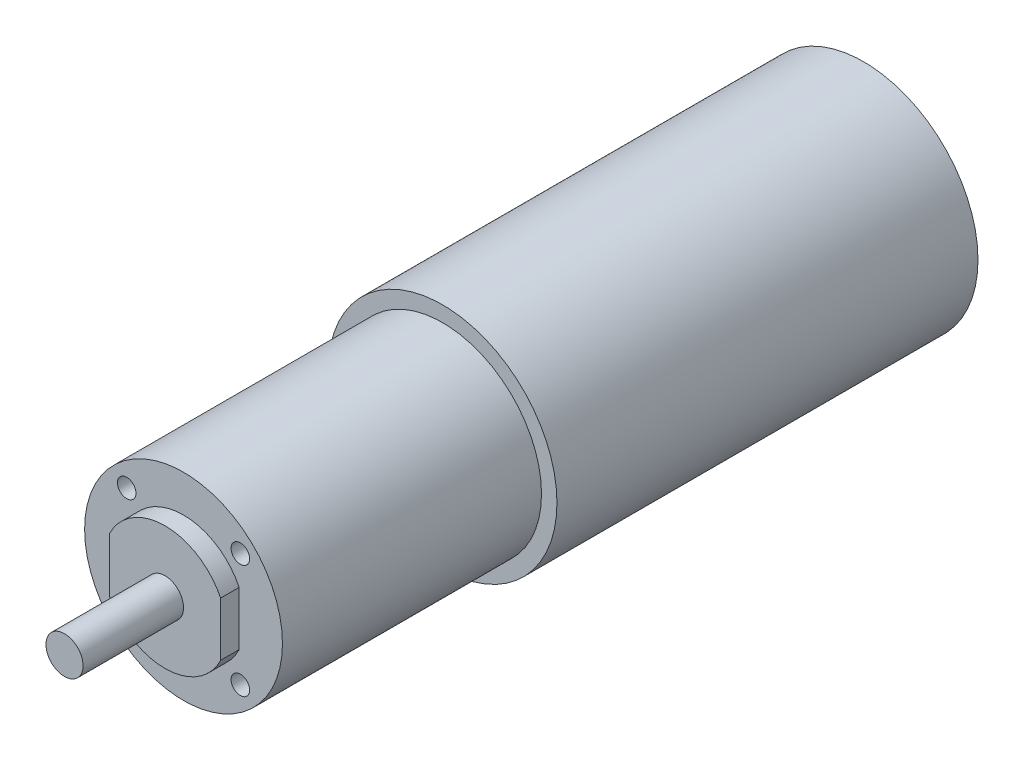
ISO-10303-21;
HEADER;
FILE_DESCRIPTION(('STEP AP214'),'2;1');
FILE_NAME('part.step','',(''),(''),'','','');
FILE_SCHEMA(('AUTOMOTIVE_DESIGN { 1 0 10303 214 1 1 1 1 }'));
ENDSEC;
DATA;
#1=APPLICATION_CONTEXT('core data for automotive mechanical design processes');
#2=APPLICATION_PROTOCOL_DEFINITION('international standard','automotive_design',2000,#1);
#3=PRODUCT_CONTEXT('',#1,'mechanical');
#4=PRODUCT('Part','Part','',(#3));
#5=PRODUCT_RELATED_PRODUCT_CATEGORY('part','',(#4));
#6=PRODUCT_DEFINITION_FORMATION('','',#4);
#7=PRODUCT_DEFINITION_CONTEXT('part definition',#1,'design');
#8=PRODUCT_DEFINITION('design','',#6,#7);
#9=PRODUCT_DEFINITION_SHAPE('','',#8);
#10=(LENGTH_UNIT() NAMED_UNIT(*) SI_UNIT(.MILLI.,.METRE.));
#11=(NAMED_UNIT(*) PLANE_ANGLE_UNIT() SI_UNIT($,.RADIAN.));
#12=(NAMED_UNIT(*) SI_UNIT($,.STERADIAN.) SOLID_ANGLE_UNIT());
#13=UNCERTAINTY_MEASURE_WITH_UNIT(LENGTH_MEASURE(1.E-05),#10,'distance_accuracy_value','');
#14=(GEOMETRIC_REPRESENTATION_CONTEXT(3) GLOBAL_UNCERTAINTY_ASSIGNED_CONTEXT((#13)) GLOBAL_UNIT_ASSIGNED_CONTEXT((#10,
#11,#12)) REPRESENTATION_CONTEXT('',''));
#15=CARTESIAN_POINT('',(0.,0.,0.));
#16=DIRECTION('',(0.,0.,1.));
#17=DIRECTION('',(1.,0.,0.));
#18=AXIS2_PLACEMENT_3D('',#15,#16,#17);
#19=CARTESIAN_POINT('',(0.,0.,41.9));
#20=DIRECTION('',(0.,0.,1.));
#21=DIRECTION('',(1.,0.,0.));
#22=AXIS2_PLACEMENT_3D('',#19,#20,#21);
#23=PLANE('',#22);
#24=CARTESIAN_POINT('',(-9.19238815542512,-9.19238815542512,41.9));
#25=DIRECTION('',(0.,0.,1.));
#26=DIRECTION('',(1.,0.,0.));
#27=AXIS2_PLACEMENT_3D('',#24,#25,#26);
#28=CIRCLE('',#27,1.5);
#29=CARTESIAN_POINT('',(-7.69238815542512,-9.19238815542512,41.9));
#30=VERTEX_POINT('',#29);
#31=EDGE_CURVE('E131',#30,#30,#28,.T.);
#32=ORIENTED_EDGE('',*,*,#31,.F.);
#33=EDGE_LOOP('',(#32));
#34=FACE_BOUND('',#33,.T.);
#35=CARTESIAN_POINT('',(9.19238815542512,-9.19238815542511,41.9));
#36=DIRECTION('',(0.,0.,1.));
#37=DIRECTION('',(1.,0.,0.));
#38=AXIS2_PLACEMENT_3D('',#35,#36,#37);
#39=CIRCLE('',#38,1.5);
#40=CARTESIAN_POINT('',(10.6923881554251,-9.19238815542511,41.9));
#41=VERTEX_POINT('',#40);
#42=EDGE_CURVE('E145',#41,#41,#39,.T.);
#43=ORIENTED_EDGE('',*,*,#42,.F.);
#44=EDGE_LOOP('',(#43));
#45=FACE_BOUND('',#44,.T.);
#46=CARTESIAN_POINT('',(9.19238815542511,9.19238815542512,41.9));
#47=DIRECTION('',(0.,0.,1.));
#48=DIRECTION('',(1.,0.,0.));
#49=AXIS2_PLACEMENT_3D('',#46,#47,#48);
#50=CIRCLE('',#49,1.5);
#51=CARTESIAN_POINT('',(10.6923881554251,9.19238815542512,41.9));
#52=VERTEX_POINT('',#51);
#53=EDGE_CURVE('E137',#52,#52,#50,.T.);
#54=ORIENTED_EDGE('',*,*,#53,.F.);
#55=EDGE_LOOP('',(#54));
#56=FACE_BOUND('',#55,.T.);
#57=CARTESIAN_POINT('',(-9.19238815542512,9.19238815542511,41.9));
#58=DIRECTION('',(0.,0.,1.));
#59=DIRECTION('',(1.,0.,0.));
#60=AXIS2_PLACEMENT_3D('',#57,#58,#59);
#61=CIRCLE('',#60,1.5);
#62=CARTESIAN_POINT('',(-7.69238815542512,9.19238815542511,41.9));
#63=VERTEX_POINT('',#62);
#64=EDGE_CURVE('E136',#63,#63,#61,.T.);
#65=ORIENTED_EDGE('',*,*,#64,.F.);
#66=EDGE_LOOP('',(#65));
#67=FACE_BOUND('',#66,.T.);
#68=CARTESIAN_POINT('',(0.,0.,41.9));
#69=DIRECTION('',(0.,0.,1.));
#70=DIRECTION('',(1.,0.,0.));
#71=AXIS2_PLACEMENT_3D('',#68,#69,#70);
#72=CIRCLE('',#71,16.);
#73=CARTESIAN_POINT('',(16.,0.,41.9));
#74=VERTEX_POINT('',#73);
#75=EDGE_CURVE('E49',#74,#74,#72,.T.);
#76=ORIENTED_EDGE('',*,*,#75,.T.);
#77=EDGE_LOOP('',(#76));
#78=FACE_BOUND('',#77,.T.);
#79=DIRECTION('',(0.,-1.,0.));
#80=VECTOR('',#79,1.);
#81=CARTESIAN_POINT('',(-9.,4.35889894354068,41.9));
#82=LINE('',#81,#80);
#83=CARTESIAN_POINT('',(-9.,4.35889894354068,41.9));
#84=VERTEX_POINT('',#83);
#85=CARTESIAN_POINT('',(-9.,-4.35889894354067,41.9));
#86=VERTEX_POINT('',#85);
#87=EDGE_CURVE('E99',#84,#86,#82,.T.);
#88=ORIENTED_EDGE('',*,*,#87,.F.);
#89=CARTESIAN_POINT('',(0.,0.,41.9));
#90=DIRECTION('',(0.,0.,1.));
#91=DIRECTION('',(1.,0.,0.));
#92=AXIS2_PLACEMENT_3D('',#89,#90,#91);
#93=CIRCLE('',#92,10.);
#94=CARTESIAN_POINT('',(9.,4.35889894354067,41.9));
#95=VERTEX_POINT('',#94);
#96=EDGE_CURVE('E113',#95,#84,#93,.T.);
#97=ORIENTED_EDGE('',*,*,#96,.F.);
#98=DIRECTION('',(0.,1.,0.));
#99=VECTOR('',#98,1.);
#100=CARTESIAN_POINT('',(9.,4.35889894354067,41.9));
#101=LINE('',#100,#99);
#102=CARTESIAN_POINT('',(9.,-4.35889894354067,41.9));
#103=VERTEX_POINT('',#102);
#104=EDGE_CURVE('E79',#103,#95,#101,.T.);
#105=ORIENTED_EDGE('',*,*,#104,.F.);
#106=CARTESIAN_POINT('',(0.,0.,41.9));
#107=DIRECTION('',(0.,0.,1.));
#108=DIRECTION('',(1.,0.,0.));
#109=AXIS2_PLACEMENT_3D('',#106,#107,#108);
#110=CIRCLE('',#109,10.);
#111=EDGE_CURVE('E120',#86,#103,#110,.T.);
#112=ORIENTED_EDGE('',*,*,#111,.F.);
#113=EDGE_LOOP('',(#88,#97,#105,#112));
#114=FACE_BOUND('',#113,.T.);
#115=ADVANCED_FACE('F39',(#34,#45,#56,#67,#78,#114),#23,.T.);
#116=CARTESIAN_POINT('',(0.,0.,41.9));
#117=DIRECTION('',(0.,0.,-1.));
#118=DIRECTION('',(-1.,0.,0.));
#119=AXIS2_PLACEMENT_3D('',#116,#117,#118);
#120=CYLINDRICAL_SURFACE('',#119,16.);
#121=ORIENTED_EDGE('',*,*,#75,.F.);
#122=EDGE_LOOP('',(#121));
#123=FACE_BOUND('',#122,.T.);
#124=CARTESIAN_POINT('',(0.,0.,0.));
#125=DIRECTION('',(0.,0.,1.));
#126=DIRECTION('',(1.,0.,0.));
#127=AXIS2_PLACEMENT_3D('',#124,#125,#126);
#128=CIRCLE('',#127,16.);
#129=CARTESIAN_POINT('',(16.,0.,0.));
#130=VERTEX_POINT('',#129);
#131=EDGE_CURVE('E43',#130,#130,#128,.T.);
#132=ORIENTED_EDGE('',*,*,#131,.T.);
#133=EDGE_LOOP('',(#132));
#134=FACE_BOUND('',#133,.T.);
#135=ADVANCED_FACE('F41',(#123,#134),#120,.T.);
#136=CARTESIAN_POINT('',(-9.19238815542512,9.19238815542511,36.9));
#137=DIRECTION('',(0.,0.,1.));
#138=DIRECTION('',(1.,0.,0.));
#139=AXIS2_PLACEMENT_3D('',#136,#137,#138);
#140=CYLINDRICAL_SURFACE('',#139,1.5);
#141=CARTESIAN_POINT('',(-9.19238815542512,9.19238815542511,36.9));
#142=DIRECTION('',(0.,0.,1.));
#143=DIRECTION('',(1.,0.,0.));
#144=AXIS2_PLACEMENT_3D('',#141,#142,#143);
#145=CIRCLE('',#144,1.5);
#146=CARTESIAN_POINT('',(-7.69238815542512,9.19238815542511,36.9));
#147=VERTEX_POINT('',#146);
#148=EDGE_CURVE('E156',#147,#147,#145,.T.);
#149=ORIENTED_EDGE('',*,*,#148,.F.);
#150=EDGE_LOOP('',(#149));
#151=FACE_BOUND('',#150,.T.);
#152=ORIENTED_EDGE('',*,*,#64,.T.);
#153=EDGE_LOOP('',(#152));
#154=FACE_BOUND('',#153,.T.);
#155=ADVANCED_FACE('F170',(#151,#154),#140,.F.);
#156=CARTESIAN_POINT('',(-9.19238815542512,9.19238815542511,36.9));
#157=DIRECTION('',(0.,0.,1.));
#158=DIRECTION('',(1.,0.,0.));
#159=AXIS2_PLACEMENT_3D('',#156,#157,#158);
#160=PLANE('',#159);
#161=ORIENTED_EDGE('',*,*,#148,.T.);
#162=EDGE_LOOP('',(#161));
#163=FACE_BOUND('',#162,.T.);
#164=ADVANCED_FACE('F211',(#163),#160,.T.);
#165=CARTESIAN_POINT('',(9.19238815542511,9.19238815542512,36.9));
#166=DIRECTION('',(0.,0.,1.));
#167=DIRECTION('',(1.,0.,0.));
#168=AXIS2_PLACEMENT_3D('',#165,#166,#167);
#169=CYLINDRICAL_SURFACE('',#168,1.5);
#170=CARTESIAN_POINT('',(9.19238815542511,9.19238815542512,36.9));
#171=DIRECTION('',(0.,0.,1.));
#172=DIRECTION('',(1.,0.,0.));
#173=AXIS2_PLACEMENT_3D('',#170,#171,#172);
#174=CIRCLE('',#173,1.5);
#175=CARTESIAN_POINT('',(10.6923881554251,9.19238815542512,36.9));
#176=VERTEX_POINT('',#175);
#177=EDGE_CURVE('E132',#176,#176,#174,.T.);
#178=ORIENTED_EDGE('',*,*,#177,.F.);
#179=EDGE_LOOP('',(#178));
#180=FACE_BOUND('',#179,.T.);
#181=ORIENTED_EDGE('',*,*,#53,.T.);
#182=EDGE_LOOP('',(#181));
#183=FACE_BOUND('',#182,.T.);
#184=ADVANCED_FACE('F215',(#180,#183),#169,.F.);
#185=CARTESIAN_POINT('',(9.19238815542511,9.19238815542512,36.9));
#186=DIRECTION('',(0.,0.,1.));
#187=DIRECTION('',(1.,0.,0.));
#188=AXIS2_PLACEMENT_3D('',#185,#186,#187);
#189=PLANE('',#188);
#190=ORIENTED_EDGE('',*,*,#177,.T.);
#191=EDGE_LOOP('',(#190));
#192=FACE_BOUND('',#191,.T.);
#193=ADVANCED_FACE('F230',(#192),#189,.T.);
#194=CARTESIAN_POINT('',(9.19238815542512,-9.19238815542511,36.9));
#195=DIRECTION('',(0.,0.,1.));
#196=DIRECTION('',(1.,0.,0.));
#197=AXIS2_PLACEMENT_3D('',#194,#195,#196);
#198=CYLINDRICAL_SURFACE('',#197,1.5);
#199=CARTESIAN_POINT('',(9.19238815542512,-9.19238815542511,36.9));
#200=DIRECTION('',(0.,0.,1.));
#201=DIRECTION('',(1.,0.,0.));
#202=AXIS2_PLACEMENT_3D('',#199,#200,#201);
#203=CIRCLE('',#202,1.5);
#204=CARTESIAN_POINT('',(10.6923881554251,-9.19238815542511,36.9));
#205=VERTEX_POINT('',#204);
#206=EDGE_CURVE('E141',#205,#205,#203,.T.);
#207=ORIENTED_EDGE('',*,*,#206,.F.);
#208=EDGE_LOOP('',(#207));
#209=FACE_BOUND('',#208,.T.);
#210=ORIENTED_EDGE('',*,*,#42,.T.);
#211=EDGE_LOOP('',(#210));
#212=FACE_BOUND('',#211,.T.);
#213=ADVANCED_FACE('F227',(#209,#212),#198,.F.);
#214=CARTESIAN_POINT('',(9.19238815542512,-9.19238815542511,36.9));
#215=DIRECTION('',(0.,0.,1.));
#216=DIRECTION('',(1.,0.,0.));
#217=AXIS2_PLACEMENT_3D('',#214,#215,#216);
#218=PLANE('',#217);
#219=ORIENTED_EDGE('',*,*,#206,.T.);
#220=EDGE_LOOP('',(#219));
#221=FACE_BOUND('',#220,.T.);
#222=ADVANCED_FACE('F221',(#221),#218,.T.);
#223=CARTESIAN_POINT('',(-9.19238815542512,-9.19238815542512,36.9));
#224=DIRECTION('',(0.,0.,1.));
#225=DIRECTION('',(1.,0.,0.));
#226=AXIS2_PLACEMENT_3D('',#223,#224,#225);
#227=CYLINDRICAL_SURFACE('',#226,1.5);
#228=CARTESIAN_POINT('',(-9.19238815542512,-9.19238815542512,36.9));
#229=DIRECTION('',(0.,0.,1.));
#230=DIRECTION('',(1.,0.,0.));
#231=AXIS2_PLACEMENT_3D('',#228,#229,#230);
#232=CIRCLE('',#231,1.5);
#233=CARTESIAN_POINT('',(-7.69238815542512,-9.19238815542512,36.9));
#234=VERTEX_POINT('',#233);
#235=EDGE_CURVE('E149',#234,#234,#232,.T.);
#236=ORIENTED_EDGE('',*,*,#235,.F.);
#237=EDGE_LOOP('',(#236));
#238=FACE_BOUND('',#237,.T.);
#239=ORIENTED_EDGE('',*,*,#31,.T.);
#240=EDGE_LOOP('',(#239));
#241=FACE_BOUND('',#240,.T.);
#242=ADVANCED_FACE('F217',(#238,#241),#227,.F.);
#243=CARTESIAN_POINT('',(-9.19238815542512,-9.19238815542512,36.9));
#244=DIRECTION('',(0.,0.,1.));
#245=DIRECTION('',(1.,0.,0.));
#246=AXIS2_PLACEMENT_3D('',#243,#244,#245);
#247=PLANE('',#246);
#248=ORIENTED_EDGE('',*,*,#235,.T.);
#249=EDGE_LOOP('',(#248));
#250=FACE_BOUND('',#249,.T.);
#251=ADVANCED_FACE('F220',(#250),#247,.T.);
#252=CARTESIAN_POINT('',(0.,0.,44.9));
#253=DIRECTION('',(0.,0.,-1.));
#254=DIRECTION('',(-1.,0.,0.));
#255=AXIS2_PLACEMENT_3D('',#252,#253,#254);
#256=CYLINDRICAL_SURFACE('',#255,10.);
#257=ORIENTED_EDGE('',*,*,#96,.T.);
#258=DIRECTION('',(0.,0.,-1.));
#259=VECTOR('',#258,1.);
#260=CARTESIAN_POINT('',(-9.,4.35889894354068,44.9));
#261=LINE('',#260,#259);
#262=CARTESIAN_POINT('',(-9.,4.35889894354068,44.9));
#263=VERTEX_POINT('',#262);
#264=EDGE_CURVE('E103',#263,#84,#261,.T.);
#265=ORIENTED_EDGE('',*,*,#264,.F.);
#266=CARTESIAN_POINT('',(0.,0.,44.9));
#267=DIRECTION('',(0.,0.,1.));
#268=DIRECTION('',(1.,0.,0.));
#269=AXIS2_PLACEMENT_3D('',#266,#267,#268);
#270=CIRCLE('',#269,10.);
#271=CARTESIAN_POINT('',(9.,4.35889894354067,44.9));
#272=VERTEX_POINT('',#271);
#273=EDGE_CURVE('E91',#272,#263,#270,.T.);
#274=ORIENTED_EDGE('',*,*,#273,.F.);
#275=DIRECTION('',(0.,0.,-1.));
#276=VECTOR('',#275,1.);
#277=CARTESIAN_POINT('',(9.,4.35889894354067,44.9));
#278=LINE('',#277,#276);
#279=EDGE_CURVE('E109',#272,#95,#278,.T.);
#280=ORIENTED_EDGE('',*,*,#279,.T.);
#281=EDGE_LOOP('',(#257,#265,#274,#280));
#282=FACE_BOUND('',#281,.T.);
#283=ADVANCED_FACE('F225',(#282),#256,.T.);
#284=CARTESIAN_POINT('',(-9.,4.35889894354068,44.9));
#285=DIRECTION('',(1.,0.,0.));
#286=DIRECTION('',(0.,0.,-1.));
#287=AXIS2_PLACEMENT_3D('',#284,#285,#286);
#288=PLANE('',#287);
#289=ORIENTED_EDGE('',*,*,#87,.T.);
#290=DIRECTION('',(0.,0.,-1.));
#291=VECTOR('',#290,1.);
#292=CARTESIAN_POINT('',(-9.,-4.35889894354067,44.9));
#293=LINE('',#292,#291);
#294=CARTESIAN_POINT('',(-9.,-4.35889894354067,44.9));
#295=VERTEX_POINT('',#294);
#296=EDGE_CURVE('E96',#295,#86,#293,.T.);
#297=ORIENTED_EDGE('',*,*,#296,.F.);
#298=DIRECTION('',(0.,-1.,0.));
#299=VECTOR('',#298,1.);
#300=CARTESIAN_POINT('',(-9.,4.35889894354068,44.9));
#301=LINE('',#300,#299);
#302=EDGE_CURVE('E86',#263,#295,#301,.T.);
#303=ORIENTED_EDGE('',*,*,#302,.F.);
#304=ORIENTED_EDGE('',*,*,#264,.T.);
#305=EDGE_LOOP('',(#289,#297,#303,#304));
#306=FACE_BOUND('',#305,.T.);
#307=ADVANCED_FACE('F97',(#306),#288,.F.);
#308=CARTESIAN_POINT('',(0.,0.,44.9));
#309=DIRECTION('',(0.,0.,-1.));
#310=DIRECTION('',(-1.,0.,0.));
#311=AXIS2_PLACEMENT_3D('',#308,#309,#310);
#312=CYLINDRICAL_SURFACE('',#311,10.);
#313=ORIENTED_EDGE('',*,*,#111,.T.);
#314=DIRECTION('',(0.,0.,-1.));
#315=VECTOR('',#314,1.);
#316=CARTESIAN_POINT('',(9.,-4.35889894354067,44.9));
#317=LINE('',#316,#315);
#318=CARTESIAN_POINT('',(9.,-4.35889894354067,44.9));
#319=VERTEX_POINT('',#318);
#320=EDGE_CURVE('E57',#319,#103,#317,.T.);
#321=ORIENTED_EDGE('',*,*,#320,.F.);
#322=CARTESIAN_POINT('',(0.,0.,44.9));
#323=DIRECTION('',(0.,0.,1.));
#324=DIRECTION('',(1.,0.,0.));
#325=AXIS2_PLACEMENT_3D('',#322,#323,#324);
#326=CIRCLE('',#325,10.);
#327=EDGE_CURVE('E89',#295,#319,#326,.T.);
#328=ORIENTED_EDGE('',*,*,#327,.F.);
#329=ORIENTED_EDGE('',*,*,#296,.T.);
#330=EDGE_LOOP('',(#313,#321,#328,#329));
#331=FACE_BOUND('',#330,.T.);
#332=ADVANCED_FACE('F105',(#331),#312,.T.);
#333=CARTESIAN_POINT('',(9.,4.35889894354067,44.9));
#334=DIRECTION('',(-1.,0.,0.));
#335=DIRECTION('',(0.,0.,1.));
#336=AXIS2_PLACEMENT_3D('',#333,#334,#335);
#337=PLANE('',#336);
#338=ORIENTED_EDGE('',*,*,#104,.T.);
#339=ORIENTED_EDGE('',*,*,#279,.F.);
#340=DIRECTION('',(0.,1.,0.));
#341=VECTOR('',#340,1.);
#342=CARTESIAN_POINT('',(9.,4.35889894354067,44.9));
#343=LINE('',#342,#341);
#344=EDGE_CURVE('E65',#319,#272,#343,.T.);
#345=ORIENTED_EDGE('',*,*,#344,.F.);
#346=ORIENTED_EDGE('',*,*,#320,.T.);
#347=EDGE_LOOP('',(#338,#339,#345,#346));
#348=FACE_BOUND('',#347,.T.);
#349=ADVANCED_FACE('F248',(#348),#337,.F.);
#350=CARTESIAN_POINT('',(0.,0.,44.9));
#351=DIRECTION('',(0.,0.,1.));
#352=DIRECTION('',(1.,0.,0.));
#353=AXIS2_PLACEMENT_3D('',#350,#351,#352);
#354=PLANE('',#353);
#355=CARTESIAN_POINT('',(0.,0.,44.9));
#356=DIRECTION('',(0.,0.,1.));
#357=DIRECTION('',(1.,0.,0.));
#358=AXIS2_PLACEMENT_3D('',#355,#356,#357);
#359=CIRCLE('',#358,3.);
#360=CARTESIAN_POINT('',(3.,0.,44.9));
#361=VERTEX_POINT('',#360);
#362=EDGE_CURVE('E11',#361,#361,#359,.T.);
#363=ORIENTED_EDGE('',*,*,#362,.F.);
#364=EDGE_LOOP('',(#363));
#365=FACE_BOUND('',#364,.T.);
#366=ORIENTED_EDGE('',*,*,#273,.T.);
#367=ORIENTED_EDGE('',*,*,#302,.T.);
#368=ORIENTED_EDGE('',*,*,#327,.T.);
#369=ORIENTED_EDGE('',*,*,#344,.T.);
#370=EDGE_LOOP('',(#366,#367,#368,#369));
#371=FACE_BOUND('',#370,.T.);
#372=ADVANCED_FACE('F87',(#365,#371),#354,.T.);
#373=CARTESIAN_POINT('',(0.,0.,61.15));
#374=DIRECTION('',(0.,0.,-1.));
#375=DIRECTION('',(-1.,0.,0.));
#376=AXIS2_PLACEMENT_3D('',#373,#374,#375);
#377=CYLINDRICAL_SURFACE('',#376,3.);
#378=CARTESIAN_POINT('',(0.,0.,61.15));
#379=DIRECTION('',(0.,0.,1.));
#380=DIRECTION('',(1.,0.,0.));
#381=AXIS2_PLACEMENT_3D('',#378,#379,#380);
#382=CIRCLE('',#381,3.);
#383=CARTESIAN_POINT('',(3.,0.,61.15));
#384=VERTEX_POINT('',#383);
#385=EDGE_CURVE('E117',#384,#384,#382,.T.);
#386=ORIENTED_EDGE('',*,*,#385,.F.);
#387=EDGE_LOOP('',(#386));
#388=FACE_BOUND('',#387,.T.);
#389=ORIENTED_EDGE('',*,*,#362,.T.);
#390=EDGE_LOOP('',(#389));
#391=FACE_BOUND('',#390,.T.);
#392=ADVANCED_FACE('F253',(#388,#391),#377,.T.);
#393=CARTESIAN_POINT('',(0.,0.,61.15));
#394=DIRECTION('',(0.,0.,1.));
#395=DIRECTION('',(1.,0.,0.));
#396=AXIS2_PLACEMENT_3D('',#393,#394,#395);
#397=PLANE('',#396);
#398=ORIENTED_EDGE('',*,*,#385,.T.);
#399=EDGE_LOOP('',(#398));
#400=FACE_BOUND('',#399,.T.);
#401=ADVANCED_FACE('F257',(#400),#397,.T.);
#402=CARTESIAN_POINT('',(0.,0.,-68.1));
#403=DIRECTION('',(0.,0.,1.));
#404=DIRECTION('',(1.,0.,0.));
#405=AXIS2_PLACEMENT_3D('',#402,#403,#404);
#406=CYLINDRICAL_SURFACE('',#405,18.5);
#407=CARTESIAN_POINT('',(0.,0.,-68.1));
#408=DIRECTION('',(0.,0.,-1.));
#409=DIRECTION('',(-1.,0.,0.));
#410=AXIS2_PLACEMENT_3D('',#407,#408,#409);
#411=CIRCLE('',#410,18.5);
#412=CARTESIAN_POINT('',(-18.5,0.,-68.1));
#413=VERTEX_POINT('',#412);
#414=EDGE_CURVE('E175',#413,#413,#411,.T.);
#415=ORIENTED_EDGE('',*,*,#414,.F.);
#416=EDGE_LOOP('',(#415));
#417=FACE_BOUND('',#416,.T.);
#418=CARTESIAN_POINT('',(0.,0.,0.));
#419=DIRECTION('',(0.,0.,-1.));
#420=DIRECTION('',(-1.,0.,0.));
#421=AXIS2_PLACEMENT_3D('',#418,#419,#420);
#422=CIRCLE('',#421,18.5);
#423=CARTESIAN_POINT('',(-18.5,0.,0.));
#424=VERTEX_POINT('',#423);
#425=EDGE_CURVE('E181',#424,#424,#422,.T.);
#426=ORIENTED_EDGE('',*,*,#425,.T.);
#427=EDGE_LOOP('',(#426));
#428=FACE_BOUND('',#427,.T.);
#429=ADVANCED_FACE('F191',(#417,#428),#406,.T.);
#430=CARTESIAN_POINT('',(0.,0.,-68.1));
#431=DIRECTION('',(0.,0.,-1.));
#432=DIRECTION('',(-1.,0.,0.));
#433=AXIS2_PLACEMENT_3D('',#430,#431,#432);
#434=PLANE('',#433);
#435=ORIENTED_EDGE('',*,*,#414,.T.);
#436=EDGE_LOOP('',(#435));
#437=FACE_BOUND('',#436,.T.);
#438=ADVANCED_FACE('F195',(#437),#434,.T.);
#439=CARTESIAN_POINT('',(0.,0.,0.));
#440=DIRECTION('',(0.,0.,-1.));
#441=DIRECTION('',(-1.,0.,0.));
#442=AXIS2_PLACEMENT_3D('',#439,#440,#441);
#443=PLANE('',#442);
#444=ORIENTED_EDGE('',*,*,#131,.F.);
#445=EDGE_LOOP('',(#444));
#446=FACE_BOUND('',#445,.T.);
#447=ORIENTED_EDGE('',*,*,#425,.F.);
#448=EDGE_LOOP('',(#447));
#449=FACE_BOUND('',#448,.T.);
#450=ADVANCED_FACE('F193',(#446,#449),#443,.F.);
#451=CLOSED_SHELL('',(#115,#135,#155,#164,#184,#193,#213,#222,#242,#251,#283,#307,#332,#349,
#372,#392,#401,#429,#438,#450));
#452=MANIFOLD_SOLID_BREP('B2',#451);
#453=ADVANCED_BREP_SHAPE_REPRESENTATION('',(#18,#452),#14);
#454=SHAPE_DEFINITION_REPRESENTATION(#9,#453);
ENDSEC;
END-ISO-10303-21;
